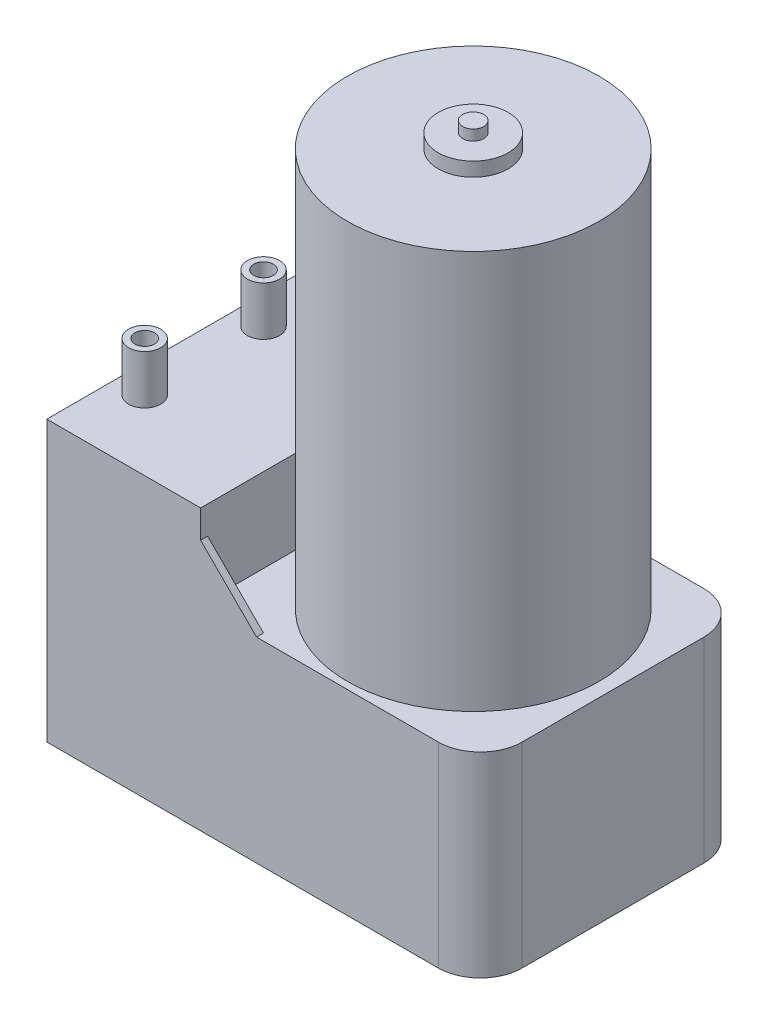
ISO-10303-21;
HEADER;
FILE_DESCRIPTION(('STEP AP214'),'2;1');
FILE_NAME('part.step','',(''),(''),'','','');
FILE_SCHEMA(('AUTOMOTIVE_DESIGN { 1 0 10303 214 1 1 1 1 }'));
ENDSEC;
DATA;
#1=APPLICATION_CONTEXT('core data for automotive mechanical design processes');
#2=APPLICATION_PROTOCOL_DEFINITION('international standard','automotive_design',2000,#1);
#3=PRODUCT_CONTEXT('',#1,'mechanical');
#4=PRODUCT('Part','Part','',(#3));
#5=PRODUCT_RELATED_PRODUCT_CATEGORY('part','',(#4));
#6=PRODUCT_DEFINITION_FORMATION('','',#4);
#7=PRODUCT_DEFINITION_CONTEXT('part definition',#1,'design');
#8=PRODUCT_DEFINITION('design','',#6,#7);
#9=PRODUCT_DEFINITION_SHAPE('','',#8);
#10=(LENGTH_UNIT() NAMED_UNIT(*) SI_UNIT(.MILLI.,.METRE.));
#11=(NAMED_UNIT(*) PLANE_ANGLE_UNIT() SI_UNIT($,.RADIAN.));
#12=(NAMED_UNIT(*) SI_UNIT($,.STERADIAN.) SOLID_ANGLE_UNIT());
#13=UNCERTAINTY_MEASURE_WITH_UNIT(LENGTH_MEASURE(1.E-05),#10,'distance_accuracy_value','');
#14=(GEOMETRIC_REPRESENTATION_CONTEXT(3) GLOBAL_UNCERTAINTY_ASSIGNED_CONTEXT((#13)) GLOBAL_UNIT_ASSIGNED_CONTEXT((#10,
#11,#12)) REPRESENTATION_CONTEXT('',''));
#15=CARTESIAN_POINT('',(0.,0.,0.));
#16=DIRECTION('',(0.,0.,1.));
#17=DIRECTION('',(1.,0.,0.));
#18=AXIS2_PLACEMENT_3D('',#15,#16,#17);
#19=CARTESIAN_POINT('',(22.,28.,-37.));
#20=DIRECTION('',(0.,-1.,0.));
#21=DIRECTION('',(0.,0.,-1.));
#22=AXIS2_PLACEMENT_3D('',#19,#20,#21);
#23=PLANE('',#22);
#24=DIRECTION('',(-1.,0.,0.));
#25=VECTOR('',#24,1.);
#26=CARTESIAN_POINT('',(22.,28.,-38.));
#27=LINE('',#26,#25);
#28=CARTESIAN_POINT('',(30.,28.,-38.));
#29=VERTEX_POINT('',#28);
#30=CARTESIAN_POINT('',(22.,28.,-38.));
#31=VERTEX_POINT('',#30);
#32=EDGE_CURVE('E98',#29,#31,#27,.T.);
#33=ORIENTED_EDGE('',*,*,#32,.F.);
#34=DIRECTION('',(0.,0.,-1.));
#35=VECTOR('',#34,1.);
#36=CARTESIAN_POINT('',(30.,28.,-37.));
#37=LINE('',#36,#35);
#38=CARTESIAN_POINT('',(30.,28.,-37.));
#39=VERTEX_POINT('',#38);
#40=EDGE_CURVE('E12',#39,#29,#37,.T.);
#41=ORIENTED_EDGE('',*,*,#40,.F.);
#42=DIRECTION('',(-1.,0.,0.));
#43=VECTOR('',#42,1.);
#44=CARTESIAN_POINT('',(22.,28.,-37.));
#45=LINE('',#44,#43);
#46=CARTESIAN_POINT('',(22.,28.,-37.));
#47=VERTEX_POINT('',#46);
#48=EDGE_CURVE('E90',#39,#47,#45,.T.);
#49=ORIENTED_EDGE('',*,*,#48,.T.);
#50=DIRECTION('',(0.,0.,-1.));
#51=VECTOR('',#50,1.);
#52=CARTESIAN_POINT('',(22.,28.,-37.));
#53=LINE('',#52,#51);
#54=EDGE_CURVE('E49',#47,#31,#53,.T.);
#55=ORIENTED_EDGE('',*,*,#54,.T.);
#56=EDGE_LOOP('',(#33,#41,#49,#55));
#57=FACE_BOUND('',#56,.T.);
#58=ADVANCED_FACE('F46',(#57),#23,.T.);
#59=CARTESIAN_POINT('',(30.,28.,-37.));
#60=DIRECTION('',(0.707106781186548,0.707106781186547,0.));
#61=DIRECTION('',(-0.707106781186547,0.707106781186548,0.));
#62=AXIS2_PLACEMENT_3D('',#59,#60,#61);
#63=PLANE('',#62);
#64=DIRECTION('',(0.707106781186547,-0.707106781186548,0.));
#65=VECTOR('',#64,1.);
#66=CARTESIAN_POINT('',(30.,28.,-38.));
#67=LINE('',#66,#65);
#68=CARTESIAN_POINT('',(22.,36.,-38.));
#69=VERTEX_POINT('',#68);
#70=EDGE_CURVE('E92',#69,#29,#67,.T.);
#71=ORIENTED_EDGE('',*,*,#70,.F.);
#72=DIRECTION('',(0.,0.,-1.));
#73=VECTOR('',#72,1.);
#74=CARTESIAN_POINT('',(22.,36.,-37.));
#75=LINE('',#74,#73);
#76=CARTESIAN_POINT('',(22.,36.,-37.));
#77=VERTEX_POINT('',#76);
#78=EDGE_CURVE('E55',#77,#69,#75,.T.);
#79=ORIENTED_EDGE('',*,*,#78,.F.);
#80=DIRECTION('',(0.707106781186547,-0.707106781186548,0.));
#81=VECTOR('',#80,1.);
#82=CARTESIAN_POINT('',(30.,28.,-37.));
#83=LINE('',#82,#81);
#84=EDGE_CURVE('E87',#77,#39,#83,.T.);
#85=ORIENTED_EDGE('',*,*,#84,.T.);
#86=ORIENTED_EDGE('',*,*,#40,.T.);
#87=EDGE_LOOP('',(#71,#79,#85,#86));
#88=FACE_BOUND('',#87,.T.);
#89=ADVANCED_FACE('F102',(#88),#63,.T.);
#90=CARTESIAN_POINT('',(22.,28.,-37.));
#91=DIRECTION('',(-1.,0.,0.));
#92=DIRECTION('',(0.,0.,1.));
#93=AXIS2_PLACEMENT_3D('',#90,#91,#92);
#94=PLANE('',#93);
#95=DIRECTION('',(0.,1.,0.));
#96=VECTOR('',#95,1.);
#97=CARTESIAN_POINT('',(22.,28.,-38.));
#98=LINE('',#97,#96);
#99=EDGE_CURVE('E85',#31,#69,#98,.T.);
#100=ORIENTED_EDGE('',*,*,#99,.F.);
#101=ORIENTED_EDGE('',*,*,#54,.F.);
#102=DIRECTION('',(0.,1.,0.));
#103=VECTOR('',#102,1.);
#104=CARTESIAN_POINT('',(22.,28.,-37.));
#105=LINE('',#104,#103);
#106=EDGE_CURVE('E83',#47,#77,#105,.T.);
#107=ORIENTED_EDGE('',*,*,#106,.T.);
#108=ORIENTED_EDGE('',*,*,#78,.T.);
#109=EDGE_LOOP('',(#100,#101,#107,#108));
#110=FACE_BOUND('',#109,.T.);
#111=ADVANCED_FACE('F82',(#110),#94,.T.);
#112=CARTESIAN_POINT('',(0.,0.,-37.));
#113=DIRECTION('',(0.,0.,1.));
#114=DIRECTION('',(1.,0.,0.));
#115=AXIS2_PLACEMENT_3D('',#112,#113,#114);
#116=PLANE('',#115);
#117=ORIENTED_EDGE('',*,*,#48,.F.);
#118=ORIENTED_EDGE('',*,*,#84,.F.);
#119=ORIENTED_EDGE('',*,*,#106,.F.);
#120=EDGE_LOOP('',(#117,#118,#119));
#121=FACE_BOUND('',#120,.T.);
#122=ADVANCED_FACE('F89',(#121),#116,.T.);
#123=CARTESIAN_POINT('',(0.,0.,-38.));
#124=DIRECTION('',(0.,0.,1.));
#125=DIRECTION('',(1.,0.,0.));
#126=AXIS2_PLACEMENT_3D('',#123,#124,#125);
#127=PLANE('',#126);
#128=ORIENTED_EDGE('',*,*,#32,.T.);
#129=ORIENTED_EDGE('',*,*,#99,.T.);
#130=ORIENTED_EDGE('',*,*,#70,.T.);
#131=EDGE_LOOP('',(#128,#129,#130));
#132=FACE_BOUND('',#131,.T.);
#133=ADVANCED_FACE('F101',(#132),#127,.F.);
#134=CLOSED_SHELL('',(#58,#89,#111,#122,#133));
#135=MANIFOLD_SOLID_BREP('B2',#134);
#136=CARTESIAN_POINT('',(0.,28.,0.));
#137=DIRECTION('',(0.,1.,0.));
#138=DIRECTION('',(0.,0.,1.));
#139=AXIS2_PLACEMENT_3D('',#136,#137,#138);
#140=PLANE('',#139);
#141=DIRECTION('',(0.,0.,1.));
#142=VECTOR('',#141,1.);
#143=CARTESIAN_POINT('',(30.,28.,-1.));
#144=LINE('',#143,#142);
#145=CARTESIAN_POINT('',(30.,28.,-1.));
#146=VERTEX_POINT('',#145);
#147=CARTESIAN_POINT('',(30.,28.,0.));
#148=VERTEX_POINT('',#147);
#149=EDGE_CURVE('E602',#146,#148,#144,.T.);
#150=ORIENTED_EDGE('',*,*,#149,.T.);
#151=DIRECTION('',(1.,0.,0.));
#152=VECTOR('',#151,1.);
#153=CARTESIAN_POINT('',(0.,28.,0.));
#154=LINE('',#153,#152);
#155=CARTESIAN_POINT('',(56.,28.,0.));
#156=VERTEX_POINT('',#155);
#157=EDGE_CURVE('E168',#148,#156,#154,.T.);
#158=ORIENTED_EDGE('',*,*,#157,.T.);
#159=CARTESIAN_POINT('',(56.,28.,-6.));
#160=DIRECTION('',(0.,1.,0.));
#161=DIRECTION('',(0.,0.,1.));
#162=AXIS2_PLACEMENT_3D('',#159,#160,#161);
#163=CIRCLE('',#162,6.);
#164=CARTESIAN_POINT('',(62.,28.,-6.));
#165=VERTEX_POINT('',#164);
#166=EDGE_CURVE('E289',#156,#165,#163,.T.);
#167=ORIENTED_EDGE('',*,*,#166,.T.);
#168=DIRECTION('',(0.,0.,-1.));
#169=VECTOR('',#168,1.);
#170=CARTESIAN_POINT('',(62.,28.,0.));
#171=LINE('',#170,#169);
#172=CARTESIAN_POINT('',(62.,28.,-32.));
#173=VERTEX_POINT('',#172);
#174=EDGE_CURVE('E256',#165,#173,#171,.T.);
#175=ORIENTED_EDGE('',*,*,#174,.T.);
#176=CARTESIAN_POINT('',(56.,28.,-32.));
#177=DIRECTION('',(0.,1.,0.));
#178=DIRECTION('',(0.,0.,1.));
#179=AXIS2_PLACEMENT_3D('',#176,#177,#178);
#180=CIRCLE('',#179,6.);
#181=CARTESIAN_POINT('',(56.,28.,-38.));
#182=VERTEX_POINT('',#181);
#183=EDGE_CURVE('E290',#173,#182,#180,.T.);
#184=ORIENTED_EDGE('',*,*,#183,.T.);
#185=DIRECTION('',(-1.,0.,0.));
#186=VECTOR('',#185,1.);
#187=CARTESIAN_POINT('',(62.,28.,-38.));
#188=LINE('',#187,#186);
#189=CARTESIAN_POINT('',(22.,28.,-38.));
#190=VERTEX_POINT('',#189);
#191=EDGE_CURVE('E243',#182,#190,#188,.T.);
#192=ORIENTED_EDGE('',*,*,#191,.T.);
#193=DIRECTION('',(0.,0.,1.));
#194=VECTOR('',#193,1.);
#195=CARTESIAN_POINT('',(22.,28.,-38.));
#196=LINE('',#195,#194);
#197=CARTESIAN_POINT('',(22.,28.,-1.));
#198=VERTEX_POINT('',#197);
#199=EDGE_CURVE('E235',#190,#198,#196,.T.);
#200=ORIENTED_EDGE('',*,*,#199,.T.);
#201=DIRECTION('',(1.,0.,0.));
#202=VECTOR('',#201,1.);
#203=CARTESIAN_POINT('',(22.,28.,-1.));
#204=LINE('',#203,#202);
#205=EDGE_CURVE('E223',#198,#146,#204,.T.);
#206=ORIENTED_EDGE('',*,*,#205,.T.);
#207=EDGE_LOOP('',(#150,#158,#167,#175,#184,#192,#200,#206));
#208=FACE_BOUND('',#207,.T.);
#209=CARTESIAN_POINT('',(42.,28.,-19.));
#210=DIRECTION('',(0.,1.,0.));
#211=DIRECTION('',(0.,0.,1.));
#212=AXIS2_PLACEMENT_3D('',#209,#210,#211);
#213=CIRCLE('',#212,18.);
#214=CARTESIAN_POINT('',(42.,28.,-37.));
#215=VERTEX_POINT('',#214);
#216=EDGE_CURVE('E306',#215,#215,#213,.T.);
#217=ORIENTED_EDGE('',*,*,#216,.F.);
#218=EDGE_LOOP('',(#217));
#219=FACE_BOUND('',#218,.T.);
#220=ADVANCED_FACE('F144',(#208,#219),#140,.T.);
#221=CARTESIAN_POINT('',(0.,28.,-38.));
#222=DIRECTION('',(1.,0.,0.));
#223=DIRECTION('',(0.,0.,-1.));
#224=AXIS2_PLACEMENT_3D('',#221,#222,#223);
#225=PLANE('',#224);
#226=DIRECTION('',(0.,0.,1.));
#227=VECTOR('',#226,1.);
#228=CARTESIAN_POINT('',(0.,0.,-38.));
#229=LINE('',#228,#227);
#230=CARTESIAN_POINT('',(0.,0.,-38.));
#231=VERTEX_POINT('',#230);
#232=CARTESIAN_POINT('',(0.,0.,0.));
#233=VERTEX_POINT('',#232);
#234=EDGE_CURVE('E262',#231,#233,#229,.T.);
#235=ORIENTED_EDGE('',*,*,#234,.T.);
#236=DIRECTION('',(0.,-1.,0.));
#237=VECTOR('',#236,1.);
#238=CARTESIAN_POINT('',(0.,28.,0.));
#239=LINE('',#238,#237);
#240=CARTESIAN_POINT('',(0.,40.,0.));
#241=VERTEX_POINT('',#240);
#242=EDGE_CURVE('E274',#241,#233,#239,.T.);
#243=ORIENTED_EDGE('',*,*,#242,.F.);
#244=DIRECTION('',(0.,0.,1.));
#245=VECTOR('',#244,1.);
#246=CARTESIAN_POINT('',(0.,40.,-38.));
#247=LINE('',#246,#245);
#248=CARTESIAN_POINT('',(0.,40.,-38.));
#249=VERTEX_POINT('',#248);
#250=EDGE_CURVE('E248',#249,#241,#247,.T.);
#251=ORIENTED_EDGE('',*,*,#250,.F.);
#252=DIRECTION('',(0.,-1.,0.));
#253=VECTOR('',#252,1.);
#254=CARTESIAN_POINT('',(0.,28.,-38.));
#255=LINE('',#254,#253);
#256=EDGE_CURVE('E261',#249,#231,#255,.T.);
#257=ORIENTED_EDGE('',*,*,#256,.T.);
#258=EDGE_LOOP('',(#235,#243,#251,#257));
#259=FACE_BOUND('',#258,.T.);
#260=ADVANCED_FACE('F349',(#259),#225,.F.);
#261=CARTESIAN_POINT('',(0.,28.,0.));
#262=DIRECTION('',(0.,0.,-1.));
#263=DIRECTION('',(-1.,0.,0.));
#264=AXIS2_PLACEMENT_3D('',#261,#262,#263);
#265=PLANE('',#264);
#266=ORIENTED_EDGE('',*,*,#157,.F.);
#267=DIRECTION('',(-0.707106781186547,0.707106781186548,0.));
#268=VECTOR('',#267,1.);
#269=CARTESIAN_POINT('',(22.,36.,0.));
#270=LINE('',#269,#268);
#271=CARTESIAN_POINT('',(22.,36.,0.));
#272=VERTEX_POINT('',#271);
#273=EDGE_CURVE('E161',#148,#272,#270,.T.);
#274=ORIENTED_EDGE('',*,*,#273,.T.);
#275=DIRECTION('',(0.,1.,0.));
#276=VECTOR('',#275,1.);
#277=CARTESIAN_POINT('',(22.,40.,0.));
#278=LINE('',#277,#276);
#279=CARTESIAN_POINT('',(22.,40.,0.));
#280=VERTEX_POINT('',#279);
#281=EDGE_CURVE('E330',#272,#280,#278,.T.);
#282=ORIENTED_EDGE('',*,*,#281,.T.);
#283=DIRECTION('',(-1.,0.,0.));
#284=VECTOR('',#283,1.);
#285=CARTESIAN_POINT('',(0.,40.,0.));
#286=LINE('',#285,#284);
#287=EDGE_CURVE('E333',#280,#241,#286,.T.);
#288=ORIENTED_EDGE('',*,*,#287,.T.);
#289=ORIENTED_EDGE('',*,*,#242,.T.);
#290=DIRECTION('',(1.,0.,0.));
#291=VECTOR('',#290,1.);
#292=CARTESIAN_POINT('',(0.,0.,0.));
#293=LINE('',#292,#291);
#294=CARTESIAN_POINT('',(56.,0.,0.));
#295=VERTEX_POINT('',#294);
#296=EDGE_CURVE('E265',#233,#295,#293,.T.);
#297=ORIENTED_EDGE('',*,*,#296,.T.);
#298=DIRECTION('',(0.,-1.,0.));
#299=VECTOR('',#298,1.);
#300=CARTESIAN_POINT('',(56.,28.,0.));
#301=LINE('',#300,#299);
#302=EDGE_CURVE('E148',#295,#156,#301,.F.);
#303=ORIENTED_EDGE('',*,*,#302,.T.);
#304=EDGE_LOOP('',(#266,#274,#282,#288,#289,#297,#303));
#305=FACE_BOUND('',#304,.T.);
#306=ADVANCED_FACE('F344',(#305),#265,.F.);
#307=CARTESIAN_POINT('',(62.,28.,0.));
#308=DIRECTION('',(-1.,0.,0.));
#309=DIRECTION('',(0.,0.,1.));
#310=AXIS2_PLACEMENT_3D('',#307,#308,#309);
#311=PLANE('',#310);
#312=DIRECTION('',(0.,0.,-1.));
#313=VECTOR('',#312,1.);
#314=CARTESIAN_POINT('',(62.,0.,0.));
#315=LINE('',#314,#313);
#316=CARTESIAN_POINT('',(62.,0.,-6.));
#317=VERTEX_POINT('',#316);
#318=CARTESIAN_POINT('',(62.,0.,-32.));
#319=VERTEX_POINT('',#318);
#320=EDGE_CURVE('E268',#317,#319,#315,.T.);
#321=ORIENTED_EDGE('',*,*,#320,.T.);
#322=DIRECTION('',(0.,-1.,0.));
#323=VECTOR('',#322,1.);
#324=CARTESIAN_POINT('',(62.,28.,-32.));
#325=LINE('',#324,#323);
#326=EDGE_CURVE('E287',#319,#173,#325,.F.);
#327=ORIENTED_EDGE('',*,*,#326,.T.);
#328=ORIENTED_EDGE('',*,*,#174,.F.);
#329=DIRECTION('',(0.,-1.,0.));
#330=VECTOR('',#329,1.);
#331=CARTESIAN_POINT('',(62.,28.,-6.));
#332=LINE('',#331,#330);
#333=EDGE_CURVE('E284',#165,#317,#332,.T.);
#334=ORIENTED_EDGE('',*,*,#333,.T.);
#335=EDGE_LOOP('',(#321,#327,#328,#334));
#336=FACE_BOUND('',#335,.T.);
#337=ADVANCED_FACE('F357',(#336),#311,.F.);
#338=CARTESIAN_POINT('',(62.,28.,-38.));
#339=DIRECTION('',(0.,0.,1.));
#340=DIRECTION('',(1.,0.,0.));
#341=AXIS2_PLACEMENT_3D('',#338,#339,#340);
#342=PLANE('',#341);
#343=ORIENTED_EDGE('',*,*,#191,.F.);
#344=DIRECTION('',(0.,-1.,0.));
#345=VECTOR('',#344,1.);
#346=CARTESIAN_POINT('',(56.,28.,-38.));
#347=LINE('',#346,#345);
#348=CARTESIAN_POINT('',(56.,0.,-38.));
#349=VERTEX_POINT('',#348);
#350=EDGE_CURVE('E277',#182,#349,#347,.T.);
#351=ORIENTED_EDGE('',*,*,#350,.T.);
#352=DIRECTION('',(-1.,0.,0.));
#353=VECTOR('',#352,1.);
#354=CARTESIAN_POINT('',(62.,0.,-38.));
#355=LINE('',#354,#353);
#356=EDGE_CURVE('E257',#349,#231,#355,.T.);
#357=ORIENTED_EDGE('',*,*,#356,.T.);
#358=ORIENTED_EDGE('',*,*,#256,.F.);
#359=DIRECTION('',(-1.,0.,0.));
#360=VECTOR('',#359,1.);
#361=CARTESIAN_POINT('',(0.,40.,-38.));
#362=LINE('',#361,#360);
#363=CARTESIAN_POINT('',(22.,40.,-38.));
#364=VERTEX_POINT('',#363);
#365=EDGE_CURVE('E245',#364,#249,#362,.T.);
#366=ORIENTED_EDGE('',*,*,#365,.F.);
#367=DIRECTION('',(0.,1.,0.));
#368=VECTOR('',#367,1.);
#369=CARTESIAN_POINT('',(22.,40.,-38.));
#370=LINE('',#369,#368);
#371=EDGE_CURVE('E251',#190,#364,#370,.T.);
#372=ORIENTED_EDGE('',*,*,#371,.F.);
#373=EDGE_LOOP('',(#343,#351,#357,#358,#366,#372));
#374=FACE_BOUND('',#373,.T.);
#375=ADVANCED_FACE('F346',(#374),#342,.F.);
#376=CARTESIAN_POINT('',(0.,0.,0.));
#377=DIRECTION('',(0.,1.,0.));
#378=DIRECTION('',(0.,0.,1.));
#379=AXIS2_PLACEMENT_3D('',#376,#377,#378);
#380=PLANE('',#379);
#381=ORIENTED_EDGE('',*,*,#356,.F.);
#382=CARTESIAN_POINT('',(56.,0.,-32.));
#383=DIRECTION('',(0.,1.,0.));
#384=DIRECTION('',(0.,0.,1.));
#385=AXIS2_PLACEMENT_3D('',#382,#383,#384);
#386=CIRCLE('',#385,6.);
#387=EDGE_CURVE('E282',#349,#319,#386,.F.);
#388=ORIENTED_EDGE('',*,*,#387,.T.);
#389=ORIENTED_EDGE('',*,*,#320,.F.);
#390=CARTESIAN_POINT('',(56.,0.,-6.));
#391=DIRECTION('',(0.,1.,0.));
#392=DIRECTION('',(0.,0.,1.));
#393=AXIS2_PLACEMENT_3D('',#390,#391,#392);
#394=CIRCLE('',#393,6.);
#395=EDGE_CURVE('E280',#317,#295,#394,.F.);
#396=ORIENTED_EDGE('',*,*,#395,.T.);
#397=ORIENTED_EDGE('',*,*,#296,.F.);
#398=ORIENTED_EDGE('',*,*,#234,.F.);
#399=EDGE_LOOP('',(#381,#388,#389,#396,#397,#398));
#400=FACE_BOUND('',#399,.T.);
#401=ADVANCED_FACE('F351',(#400),#380,.F.);
#402=CARTESIAN_POINT('',(56.,28.,-32.));
#403=DIRECTION('',(0.,-1.,0.));
#404=DIRECTION('',(0.,0.,-1.));
#405=AXIS2_PLACEMENT_3D('',#402,#403,#404);
#406=CYLINDRICAL_SURFACE('',#405,6.);
#407=ORIENTED_EDGE('',*,*,#183,.F.);
#408=ORIENTED_EDGE('',*,*,#326,.F.);
#409=ORIENTED_EDGE('',*,*,#387,.F.);
#410=ORIENTED_EDGE('',*,*,#350,.F.);
#411=EDGE_LOOP('',(#407,#408,#409,#410));
#412=FACE_BOUND('',#411,.T.);
#413=ADVANCED_FACE('F360',(#412),#406,.T.);
#414=CARTESIAN_POINT('',(56.,28.,-6.));
#415=DIRECTION('',(0.,-1.,0.));
#416=DIRECTION('',(0.,0.,-1.));
#417=AXIS2_PLACEMENT_3D('',#414,#415,#416);
#418=CYLINDRICAL_SURFACE('',#417,6.);
#419=ORIENTED_EDGE('',*,*,#166,.F.);
#420=ORIENTED_EDGE('',*,*,#302,.F.);
#421=ORIENTED_EDGE('',*,*,#395,.F.);
#422=ORIENTED_EDGE('',*,*,#333,.F.);
#423=EDGE_LOOP('',(#419,#420,#421,#422));
#424=FACE_BOUND('',#423,.T.);
#425=ADVANCED_FACE('F146',(#424),#418,.T.);
#426=CARTESIAN_POINT('',(0.,40.,-38.));
#427=DIRECTION('',(0.,1.,0.));
#428=DIRECTION('',(0.,0.,1.));
#429=AXIS2_PLACEMENT_3D('',#426,#427,#428);
#430=PLANE('',#429);
#431=CARTESIAN_POINT('',(4.,40.,-27.));
#432=DIRECTION('',(0.,1.,0.));
#433=DIRECTION('',(0.,0.,1.));
#434=AXIS2_PLACEMENT_3D('',#431,#432,#433);
#435=CIRCLE('',#434,2.3);
#436=CARTESIAN_POINT('',(4.,40.,-24.7));
#437=VERTEX_POINT('',#436);
#438=EDGE_CURVE('E312',#437,#437,#435,.T.);
#439=ORIENTED_EDGE('',*,*,#438,.F.);
#440=EDGE_LOOP('',(#439));
#441=FACE_BOUND('',#440,.T.);
#442=CARTESIAN_POINT('',(4.,40.,-10.));
#443=DIRECTION('',(0.,1.,0.));
#444=DIRECTION('',(0.,0.,1.));
#445=AXIS2_PLACEMENT_3D('',#442,#443,#444);
#446=CIRCLE('',#445,2.3);
#447=CARTESIAN_POINT('',(4.,40.,-7.7));
#448=VERTEX_POINT('',#447);
#449=EDGE_CURVE('E324',#448,#448,#446,.T.);
#450=ORIENTED_EDGE('',*,*,#449,.F.);
#451=EDGE_LOOP('',(#450));
#452=FACE_BOUND('',#451,.T.);
#453=ORIENTED_EDGE('',*,*,#287,.F.);
#454=DIRECTION('',(0.,0.,1.));
#455=VECTOR('',#454,1.);
#456=CARTESIAN_POINT('',(22.,40.,-38.));
#457=LINE('',#456,#455);
#458=EDGE_CURVE('E244',#364,#280,#457,.T.);
#459=ORIENTED_EDGE('',*,*,#458,.F.);
#460=ORIENTED_EDGE('',*,*,#365,.T.);
#461=ORIENTED_EDGE('',*,*,#250,.T.);
#462=EDGE_LOOP('',(#453,#459,#460,#461));
#463=FACE_BOUND('',#462,.T.);
#464=ADVANCED_FACE('F341',(#441,#452,#463),#430,.T.);
#465=CARTESIAN_POINT('',(22.,40.,-38.));
#466=DIRECTION('',(1.,0.,0.));
#467=DIRECTION('',(0.,0.,-1.));
#468=AXIS2_PLACEMENT_3D('',#465,#466,#467);
#469=PLANE('',#468);
#470=DIRECTION('',(0.,0.,1.));
#471=VECTOR('',#470,1.);
#472=CARTESIAN_POINT('',(22.,36.,-1.));
#473=LINE('',#472,#471);
#474=CARTESIAN_POINT('',(22.,36.,-1.));
#475=VERTEX_POINT('',#474);
#476=EDGE_CURVE('E238',#475,#272,#473,.T.);
#477=ORIENTED_EDGE('',*,*,#476,.F.);
#478=DIRECTION('',(0.,-1.,0.));
#479=VECTOR('',#478,1.);
#480=CARTESIAN_POINT('',(22.,28.,-1.));
#481=LINE('',#480,#479);
#482=EDGE_CURVE('E226',#475,#198,#481,.T.);
#483=ORIENTED_EDGE('',*,*,#482,.T.);
#484=ORIENTED_EDGE('',*,*,#199,.F.);
#485=ORIENTED_EDGE('',*,*,#371,.T.);
#486=ORIENTED_EDGE('',*,*,#458,.T.);
#487=ORIENTED_EDGE('',*,*,#281,.F.);
#488=EDGE_LOOP('',(#477,#483,#484,#485,#486,#487));
#489=FACE_BOUND('',#488,.T.);
#490=ADVANCED_FACE('F233',(#489),#469,.T.);
#491=CARTESIAN_POINT('',(4.,47.,-10.));
#492=DIRECTION('',(0.,-1.,0.));
#493=DIRECTION('',(0.,0.,-1.));
#494=AXIS2_PLACEMENT_3D('',#491,#492,#493);
#495=CYLINDRICAL_SURFACE('',#494,2.3);
#496=CARTESIAN_POINT('',(4.,47.,-10.));
#497=DIRECTION('',(0.,1.,0.));
#498=DIRECTION('',(0.,0.,1.));
#499=AXIS2_PLACEMENT_3D('',#496,#497,#498);
#500=CIRCLE('',#499,2.3);
#501=CARTESIAN_POINT('',(4.,47.,-7.7));
#502=VERTEX_POINT('',#501);
#503=EDGE_CURVE('E327',#502,#502,#500,.T.);
#504=ORIENTED_EDGE('',*,*,#503,.F.);
#505=EDGE_LOOP('',(#504));
#506=FACE_BOUND('',#505,.T.);
#507=ORIENTED_EDGE('',*,*,#449,.T.);
#508=EDGE_LOOP('',(#507));
#509=FACE_BOUND('',#508,.T.);
#510=ADVANCED_FACE('F451',(#506,#509),#495,.T.);
#511=CARTESIAN_POINT('',(4.,47.,-10.));
#512=DIRECTION('',(0.,1.,0.));
#513=DIRECTION('',(0.,0.,1.));
#514=AXIS2_PLACEMENT_3D('',#511,#512,#513);
#515=PLANE('',#514);
#516=CARTESIAN_POINT('',(4.,47.,-10.));
#517=DIRECTION('',(0.,1.,0.));
#518=DIRECTION('',(0.,0.,1.));
#519=AXIS2_PLACEMENT_3D('',#516,#517,#518);
#520=CIRCLE('',#519,1.4);
#521=CARTESIAN_POINT('',(4.,47.,-8.6));
#522=VERTEX_POINT('',#521);
#523=EDGE_CURVE('E313',#522,#522,#520,.T.);
#524=ORIENTED_EDGE('',*,*,#523,.F.);
#525=EDGE_LOOP('',(#524));
#526=FACE_BOUND('',#525,.T.);
#527=ORIENTED_EDGE('',*,*,#503,.T.);
#528=EDGE_LOOP('',(#527));
#529=FACE_BOUND('',#528,.T.);
#530=ADVANCED_FACE('F458',(#526,#529),#515,.T.);
#531=CARTESIAN_POINT('',(4.,47.,-27.));
#532=DIRECTION('',(0.,-1.,0.));
#533=DIRECTION('',(0.,0.,-1.));
#534=AXIS2_PLACEMENT_3D('',#531,#532,#533);
#535=CYLINDRICAL_SURFACE('',#534,2.3);
#536=CARTESIAN_POINT('',(4.,47.,-27.));
#537=DIRECTION('',(0.,1.,0.));
#538=DIRECTION('',(0.,0.,1.));
#539=AXIS2_PLACEMENT_3D('',#536,#537,#538);
#540=CIRCLE('',#539,2.3);
#541=CARTESIAN_POINT('',(4.,47.,-24.7));
#542=VERTEX_POINT('',#541);
#543=EDGE_CURVE('E321',#542,#542,#540,.T.);
#544=ORIENTED_EDGE('',*,*,#543,.F.);
#545=EDGE_LOOP('',(#544));
#546=FACE_BOUND('',#545,.T.);
#547=ORIENTED_EDGE('',*,*,#438,.T.);
#548=EDGE_LOOP('',(#547));
#549=FACE_BOUND('',#548,.T.);
#550=ADVANCED_FACE('F468',(#546,#549),#535,.T.);
#551=CARTESIAN_POINT('',(4.,47.,-27.));
#552=DIRECTION('',(0.,1.,0.));
#553=DIRECTION('',(0.,0.,1.));
#554=AXIS2_PLACEMENT_3D('',#551,#552,#553);
#555=PLANE('',#554);
#556=CARTESIAN_POINT('',(4.,47.,-27.));
#557=DIRECTION('',(0.,1.,0.));
#558=DIRECTION('',(0.,0.,1.));
#559=AXIS2_PLACEMENT_3D('',#556,#557,#558);
#560=CIRCLE('',#559,1.4);
#561=CARTESIAN_POINT('',(4.,47.,-25.6));
#562=VERTEX_POINT('',#561);
#563=EDGE_CURVE('E305',#562,#562,#560,.T.);
#564=ORIENTED_EDGE('',*,*,#563,.F.);
#565=EDGE_LOOP('',(#564));
#566=FACE_BOUND('',#565,.T.);
#567=ORIENTED_EDGE('',*,*,#543,.T.);
#568=EDGE_LOOP('',(#567));
#569=FACE_BOUND('',#568,.T.);
#570=ADVANCED_FACE('F477',(#566,#569),#555,.T.);
#571=CARTESIAN_POINT('',(4.,7.,-27.));
#572=DIRECTION('',(0.,1.,0.));
#573=DIRECTION('',(0.,0.,1.));
#574=AXIS2_PLACEMENT_3D('',#571,#572,#573);
#575=CYLINDRICAL_SURFACE('',#574,1.4);
#576=CARTESIAN_POINT('',(4.,7.,-27.));
#577=DIRECTION('',(0.,1.,0.));
#578=DIRECTION('',(0.,0.,1.));
#579=AXIS2_PLACEMENT_3D('',#576,#577,#578);
#580=CIRCLE('',#579,1.4);
#581=CARTESIAN_POINT('',(4.,7.,-25.6));
#582=VERTEX_POINT('',#581);
#583=EDGE_CURVE('E316',#582,#582,#580,.T.);
#584=ORIENTED_EDGE('',*,*,#583,.F.);
#585=EDGE_LOOP('',(#584));
#586=FACE_BOUND('',#585,.T.);
#587=ORIENTED_EDGE('',*,*,#563,.T.);
#588=EDGE_LOOP('',(#587));
#589=FACE_BOUND('',#588,.T.);
#590=ADVANCED_FACE('F485',(#586,#589),#575,.F.);
#591=CARTESIAN_POINT('',(4.,7.,-27.));
#592=DIRECTION('',(0.,1.,0.));
#593=DIRECTION('',(0.,0.,1.));
#594=AXIS2_PLACEMENT_3D('',#591,#592,#593);
#595=PLANE('',#594);
#596=ORIENTED_EDGE('',*,*,#583,.T.);
#597=EDGE_LOOP('',(#596));
#598=FACE_BOUND('',#597,.T.);
#599=ADVANCED_FACE('F494',(#598),#595,.T.);
#600=CARTESIAN_POINT('',(4.,7.,-10.));
#601=DIRECTION('',(0.,1.,0.));
#602=DIRECTION('',(0.,0.,1.));
#603=AXIS2_PLACEMENT_3D('',#600,#601,#602);
#604=CYLINDRICAL_SURFACE('',#603,1.4);
#605=CARTESIAN_POINT('',(4.,7.,-10.));
#606=DIRECTION('',(0.,1.,0.));
#607=DIRECTION('',(0.,0.,1.));
#608=AXIS2_PLACEMENT_3D('',#605,#606,#607);
#609=CIRCLE('',#608,1.4);
#610=CARTESIAN_POINT('',(4.,7.,-8.6));
#611=VERTEX_POINT('',#610);
#612=EDGE_CURVE('E309',#611,#611,#609,.T.);
#613=ORIENTED_EDGE('',*,*,#612,.F.);
#614=EDGE_LOOP('',(#613));
#615=FACE_BOUND('',#614,.T.);
#616=ORIENTED_EDGE('',*,*,#523,.T.);
#617=EDGE_LOOP('',(#616));
#618=FACE_BOUND('',#617,.T.);
#619=ADVANCED_FACE('F503',(#615,#618),#604,.F.);
#620=CARTESIAN_POINT('',(4.,7.,-10.));
#621=DIRECTION('',(0.,1.,0.));
#622=DIRECTION('',(0.,0.,1.));
#623=AXIS2_PLACEMENT_3D('',#620,#621,#622);
#624=PLANE('',#623);
#625=ORIENTED_EDGE('',*,*,#612,.T.);
#626=EDGE_LOOP('',(#625));
#627=FACE_BOUND('',#626,.T.);
#628=ADVANCED_FACE('F512',(#627),#624,.T.);
#629=CARTESIAN_POINT('',(42.,85.,-19.));
#630=DIRECTION('',(0.,-1.,0.));
#631=DIRECTION('',(0.,0.,-1.));
#632=AXIS2_PLACEMENT_3D('',#629,#630,#631);
#633=CYLINDRICAL_SURFACE('',#632,18.);
#634=CARTESIAN_POINT('',(42.,85.,-19.));
#635=DIRECTION('',(0.,1.,0.));
#636=DIRECTION('',(0.,0.,1.));
#637=AXIS2_PLACEMENT_3D('',#634,#635,#636);
#638=CIRCLE('',#637,18.);
#639=CARTESIAN_POINT('',(42.,85.,-37.));
#640=VERTEX_POINT('',#639);
#641=EDGE_CURVE('E302',#640,#640,#638,.T.);
#642=CARTESIAN_POINT('',(42.,85.,-37.));
#643=CARTESIAN_POINT('',(42.,84.40625,-37.));
#644=CARTESIAN_POINT('',(42.,83.8125,-37.));
#645=CARTESIAN_POINT('',(42.,82.625,-37.));
#646=CARTESIAN_POINT('',(42.,82.03125,-37.));
#647=CARTESIAN_POINT('',(42.,80.84375,-37.));
#648=CARTESIAN_POINT('',(42.,80.25,-37.));
#649=CARTESIAN_POINT('',(42.,79.0625,-37.));
#650=CARTESIAN_POINT('',(42.,78.46875,-37.));
#651=CARTESIAN_POINT('',(42.,77.28125,-37.));
#652=CARTESIAN_POINT('',(42.,76.6875,-37.));
#653=CARTESIAN_POINT('',(42.,75.5,-37.));
#654=CARTESIAN_POINT('',(42.,74.90625,-37.));
#655=CARTESIAN_POINT('',(42.,73.71875,-37.));
#656=CARTESIAN_POINT('',(42.,73.125,-37.));
#657=CARTESIAN_POINT('',(42.,71.9375,-37.));
#658=CARTESIAN_POINT('',(42.,71.34375,-37.));
#659=CARTESIAN_POINT('',(42.,70.15625,-37.));
#660=CARTESIAN_POINT('',(42.,69.5625,-37.));
#661=CARTESIAN_POINT('',(42.,68.375,-37.));
#662=CARTESIAN_POINT('',(42.,67.78125,-37.));
#663=CARTESIAN_POINT('',(42.,66.59375,-37.));
#664=CARTESIAN_POINT('',(42.,66.,-37.));
#665=CARTESIAN_POINT('',(42.,64.8125,-37.));
#666=CARTESIAN_POINT('',(42.,64.21875,-37.));
#667=CARTESIAN_POINT('',(42.,63.03125,-37.));
#668=CARTESIAN_POINT('',(42.,62.4375,-37.));
#669=CARTESIAN_POINT('',(42.,61.25,-37.));
#670=CARTESIAN_POINT('',(42.,60.65625,-37.));
#671=CARTESIAN_POINT('',(42.,59.46875,-37.));
#672=CARTESIAN_POINT('',(42.,58.875,-37.));
#673=CARTESIAN_POINT('',(42.,57.6875,-37.));
#674=CARTESIAN_POINT('',(42.,57.09375,-37.));
#675=CARTESIAN_POINT('',(42.,55.90625,-37.));
#676=CARTESIAN_POINT('',(42.,55.3125,-37.));
#677=CARTESIAN_POINT('',(42.,54.125,-37.));
#678=CARTESIAN_POINT('',(42.,53.53125,-37.));
#679=CARTESIAN_POINT('',(42.,52.34375,-37.));
#680=CARTESIAN_POINT('',(42.,51.75,-37.));
#681=CARTESIAN_POINT('',(42.,50.5625,-37.));
#682=CARTESIAN_POINT('',(42.,49.96875,-37.));
#683=CARTESIAN_POINT('',(42.,48.78125,-37.));
#684=CARTESIAN_POINT('',(42.,48.1875,-37.));
#685=CARTESIAN_POINT('',(42.,47.,-37.));
#686=CARTESIAN_POINT('',(42.,46.40625,-37.));
#687=CARTESIAN_POINT('',(42.,45.21875,-37.));
#688=CARTESIAN_POINT('',(42.,44.625,-37.));
#689=CARTESIAN_POINT('',(42.,43.4375,-37.));
#690=CARTESIAN_POINT('',(42.,42.84375,-37.));
#691=CARTESIAN_POINT('',(42.,41.65625,-37.));
#692=CARTESIAN_POINT('',(42.,41.0625,-37.));
#693=CARTESIAN_POINT('',(42.,39.875,-37.));
#694=CARTESIAN_POINT('',(42.,39.28125,-37.));
#695=CARTESIAN_POINT('',(42.,38.09375,-37.));
#696=CARTESIAN_POINT('',(42.,37.5,-37.));
#697=CARTESIAN_POINT('',(42.,36.3125,-37.));
#698=CARTESIAN_POINT('',(42.,35.71875,-37.));
#699=CARTESIAN_POINT('',(42.,34.53125,-37.));
#700=CARTESIAN_POINT('',(42.,33.9375,-37.));
#701=CARTESIAN_POINT('',(42.,32.75,-37.));
#702=CARTESIAN_POINT('',(42.,32.15625,-37.));
#703=CARTESIAN_POINT('',(42.,30.96875,-37.));
#704=CARTESIAN_POINT('',(42.,30.375,-37.));
#705=CARTESIAN_POINT('',(42.,29.1875,-37.));
#706=CARTESIAN_POINT('',(42.,28.59375,-37.));
#707=CARTESIAN_POINT('',(42.,28.,-37.));
#708=B_SPLINE_CURVE_WITH_KNOTS('',3,(#642,#643,#644,#645,#646,#647,#648,#649,#650,#651,#652,
#653,#654,#655,#656,#657,#658,#659,#660,#661,#662,#663,#664,#665,#666,#667,#668,#669,#670,#671,
#672,#673,#674,#675,#676,#677,#678,#679,#680,#681,#682,#683,#684,#685,#686,#687,#688,#689,#690,
#691,#692,#693,#694,#695,#696,#697,#698,#699,#700,#701,#702,#703,#704,#705,#706,#707),
.UNSPECIFIED.,.F.,.F.,(4,2,2,2,2,2,2,2,2,2,2,2,2,2,2,2,2,2,2,2,2,2,2,2,2,2,2,2,2,2,2,2,4),(0.,
1.78125000000001,3.56250000000001,5.34375000000001,7.12500000000001,8.90625,10.6875,12.46875,
14.25,16.03125,17.8125,19.59375,21.375,23.15625,24.9375,26.71875,28.5,30.28125,32.0625,33.84375,
35.625,37.40625,39.1875,40.96875,42.75,44.53125,46.3125,48.09375,49.875,51.65625,53.4375,
55.21875,57.),.UNSPECIFIED.);
#709=EDGE_CURVE('BSEAM521',#640,#215,#708,.T.);
#710=ORIENTED_EDGE('',*,*,#641,.F.);
#711=ORIENTED_EDGE('',*,*,#216,.T.);
#712=ORIENTED_EDGE('',*,*,#709,.T.);
#713=ORIENTED_EDGE('',*,*,#709,.F.);
#714=EDGE_LOOP('',(#710,#712,#711,#713));
#715=FACE_BOUND('',#714,.T.);
#716=ADVANCED_FACE('F521',(#715),#633,.T.);
#717=CARTESIAN_POINT('',(42.,85.,-19.));
#718=DIRECTION('',(0.,1.,0.));
#719=DIRECTION('',(0.,0.,1.));
#720=AXIS2_PLACEMENT_3D('',#717,#718,#719);
#721=PLANE('',#720);
#722=CARTESIAN_POINT('',(42.,85.,-19.));
#723=DIRECTION('',(0.,1.,0.));
#724=DIRECTION('',(0.,0.,1.));
#725=AXIS2_PLACEMENT_3D('',#722,#723,#724);
#726=CIRCLE('',#725,5.);
#727=CARTESIAN_POINT('',(42.,85.,-14.));
#728=VERTEX_POINT('',#727);
#729=EDGE_CURVE('E153',#728,#728,#726,.T.);
#730=ORIENTED_EDGE('',*,*,#729,.F.);
#731=EDGE_LOOP('',(#730));
#732=FACE_BOUND('',#731,.T.);
#733=ORIENTED_EDGE('',*,*,#641,.T.);
#734=EDGE_LOOP('',(#733));
#735=FACE_BOUND('',#734,.T.);
#736=ADVANCED_FACE('F530',(#732,#735),#721,.T.);
#737=CARTESIAN_POINT('',(42.,87.,-19.));
#738=DIRECTION('',(0.,-1.,0.));
#739=DIRECTION('',(0.,0.,-1.));
#740=AXIS2_PLACEMENT_3D('',#737,#738,#739);
#741=CYLINDRICAL_SURFACE('',#740,5.);
#742=CARTESIAN_POINT('',(42.,87.,-19.));
#743=DIRECTION('',(0.,1.,0.));
#744=DIRECTION('',(0.,0.,1.));
#745=AXIS2_PLACEMENT_3D('',#742,#743,#744);
#746=CIRCLE('',#745,5.);
#747=CARTESIAN_POINT('',(42.,87.,-14.));
#748=VERTEX_POINT('',#747);
#749=EDGE_CURVE('E300',#748,#748,#746,.T.);
#750=ORIENTED_EDGE('',*,*,#749,.F.);
#751=EDGE_LOOP('',(#750));
#752=FACE_BOUND('',#751,.T.);
#753=ORIENTED_EDGE('',*,*,#729,.T.);
#754=EDGE_LOOP('',(#753));
#755=FACE_BOUND('',#754,.T.);
#756=ADVANCED_FACE('F539',(#752,#755),#741,.T.);
#757=CARTESIAN_POINT('',(42.,87.,-19.));
#758=DIRECTION('',(0.,1.,0.));
#759=DIRECTION('',(0.,0.,1.));
#760=AXIS2_PLACEMENT_3D('',#757,#758,#759);
#761=PLANE('',#760);
#762=CARTESIAN_POINT('',(42.,87.,-19.));
#763=DIRECTION('',(0.,1.,0.));
#764=DIRECTION('',(0.,0.,1.));
#765=AXIS2_PLACEMENT_3D('',#762,#763,#764);
#766=CIRCLE('',#765,1.5);
#767=CARTESIAN_POINT('',(42.,87.,-17.5));
#768=VERTEX_POINT('',#767);
#769=EDGE_CURVE('E44',#768,#768,#766,.T.);
#770=ORIENTED_EDGE('',*,*,#769,.F.);
#771=EDGE_LOOP('',(#770));
#772=FACE_BOUND('',#771,.T.);
#773=ORIENTED_EDGE('',*,*,#749,.T.);
#774=EDGE_LOOP('',(#773));
#775=FACE_BOUND('',#774,.T.);
#776=ADVANCED_FACE('F547',(#772,#775),#761,.T.);
#777=CARTESIAN_POINT('',(22.,36.,-1.));
#778=DIRECTION('',(0.707106781186548,0.707106781186547,0.));
#779=DIRECTION('',(-0.707106781186547,0.707106781186548,0.));
#780=AXIS2_PLACEMENT_3D('',#777,#778,#779);
#781=PLANE('',#780);
#782=ORIENTED_EDGE('',*,*,#273,.F.);
#783=ORIENTED_EDGE('',*,*,#149,.F.);
#784=DIRECTION('',(-0.707106781186547,0.707106781186548,0.));
#785=VECTOR('',#784,1.);
#786=CARTESIAN_POINT('',(22.,36.,-1.));
#787=LINE('',#786,#785);
#788=EDGE_CURVE('E228',#146,#475,#787,.T.);
#789=ORIENTED_EDGE('',*,*,#788,.T.);
#790=ORIENTED_EDGE('',*,*,#476,.T.);
#791=EDGE_LOOP('',(#782,#783,#789,#790));
#792=FACE_BOUND('',#791,.T.);
#793=ADVANCED_FACE('F555',(#792),#781,.T.);
#794=CARTESIAN_POINT('',(0.,0.,-1.));
#795=DIRECTION('',(0.,0.,-1.));
#796=DIRECTION('',(-1.,0.,0.));
#797=AXIS2_PLACEMENT_3D('',#794,#795,#796);
#798=PLANE('',#797);
#799=ORIENTED_EDGE('',*,*,#482,.F.);
#800=ORIENTED_EDGE('',*,*,#788,.F.);
#801=ORIENTED_EDGE('',*,*,#205,.F.);
#802=EDGE_LOOP('',(#799,#800,#801));
#803=FACE_BOUND('',#802,.T.);
#804=ADVANCED_FACE('F225',(#803),#798,.T.);
#805=CARTESIAN_POINT('',(42.,88.5,-19.));
#806=DIRECTION('',(0.,-1.,0.));
#807=DIRECTION('',(0.,0.,-1.));
#808=AXIS2_PLACEMENT_3D('',#805,#806,#807);
#809=CYLINDRICAL_SURFACE('',#808,1.5);
#810=CARTESIAN_POINT('',(42.,88.5,-19.));
#811=DIRECTION('',(0.,1.,0.));
#812=DIRECTION('',(0.,0.,1.));
#813=AXIS2_PLACEMENT_3D('',#810,#811,#812);
#814=CIRCLE('',#813,1.5);
#815=CARTESIAN_POINT('',(42.,88.5,-17.5));
#816=VERTEX_POINT('',#815);
#817=EDGE_CURVE('E598',#816,#816,#814,.T.);
#818=ORIENTED_EDGE('',*,*,#817,.F.);
#819=EDGE_LOOP('',(#818));
#820=FACE_BOUND('',#819,.T.);
#821=ORIENTED_EDGE('',*,*,#769,.T.);
#822=EDGE_LOOP('',(#821));
#823=FACE_BOUND('',#822,.T.);
#824=ADVANCED_FACE('F571',(#820,#823),#809,.T.);
#825=CARTESIAN_POINT('',(42.,88.5,-19.));
#826=DIRECTION('',(0.,1.,0.));
#827=DIRECTION('',(0.,0.,1.));
#828=AXIS2_PLACEMENT_3D('',#825,#826,#827);
#829=PLANE('',#828);
#830=ORIENTED_EDGE('',*,*,#817,.T.);
#831=EDGE_LOOP('',(#830));
#832=FACE_BOUND('',#831,.T.);
#833=ADVANCED_FACE('F577',(#832),#829,.T.);
#834=CLOSED_SHELL('',(#220,#260,#306,#337,#375,#401,#413,#425,#464,#490,#510,#530,#550,#570,
#590,#599,#619,#628,#716,#736,#756,#776,#793,#804,#824,#833));
#835=MANIFOLD_SOLID_BREP('B6',#834);
#836=ADVANCED_BREP_SHAPE_REPRESENTATION('',(#18,#135,#835),#14);
#837=SHAPE_DEFINITION_REPRESENTATION(#9,#836);
ENDSEC;
END-ISO-10303-21;
